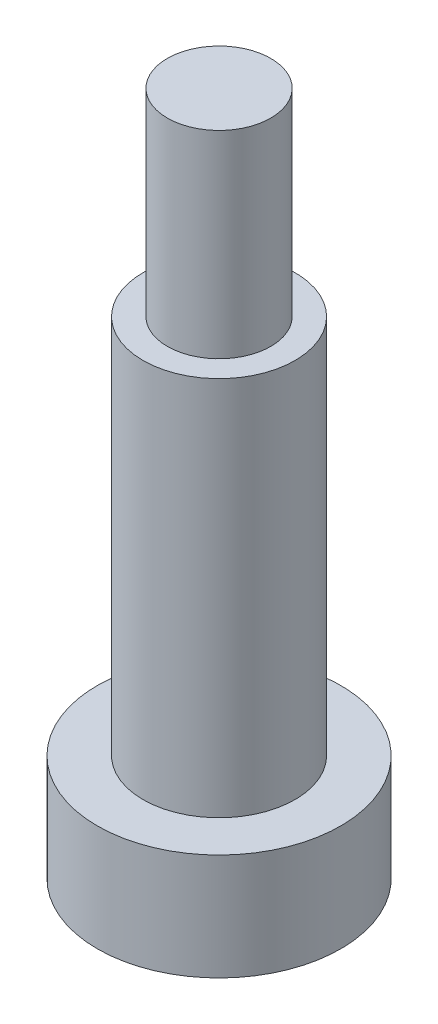
ISO-10303-21;
HEADER;
FILE_DESCRIPTION(('STEP AP214'),'2;1');
FILE_NAME('part.step','',(''),(''),'','','');
FILE_SCHEMA(('AUTOMOTIVE_DESIGN { 1 0 10303 214 1 1 1 1 }'));
ENDSEC;
DATA;
#1=APPLICATION_CONTEXT('core data for automotive mechanical design processes');
#2=APPLICATION_PROTOCOL_DEFINITION('international standard','automotive_design',2000,#1);
#3=PRODUCT_CONTEXT('',#1,'mechanical');
#4=PRODUCT('Part','Part','',(#3));
#5=PRODUCT_RELATED_PRODUCT_CATEGORY('part','',(#4));
#6=PRODUCT_DEFINITION_FORMATION('','',#4);
#7=PRODUCT_DEFINITION_CONTEXT('part definition',#1,'design');
#8=PRODUCT_DEFINITION('design','',#6,#7);
#9=PRODUCT_DEFINITION_SHAPE('','',#8);
#10=(LENGTH_UNIT() NAMED_UNIT(*) SI_UNIT(.MILLI.,.METRE.));
#11=(NAMED_UNIT(*) PLANE_ANGLE_UNIT() SI_UNIT($,.RADIAN.));
#12=(NAMED_UNIT(*) SI_UNIT($,.STERADIAN.) SOLID_ANGLE_UNIT());
#13=UNCERTAINTY_MEASURE_WITH_UNIT(LENGTH_MEASURE(1.E-05),#10,'distance_accuracy_value','');
#14=(GEOMETRIC_REPRESENTATION_CONTEXT(3) GLOBAL_UNCERTAINTY_ASSIGNED_CONTEXT((#13)) GLOBAL_UNIT_ASSIGNED_CONTEXT((#10,
#11,#12)) REPRESENTATION_CONTEXT('',''));
#15=CARTESIAN_POINT('',(0.,0.,0.));
#16=DIRECTION('',(0.,0.,1.));
#17=DIRECTION('',(1.,0.,0.));
#18=AXIS2_PLACEMENT_3D('',#15,#16,#17);
#19=CARTESIAN_POINT('',(152.4,9.825,171.45));
#20=DIRECTION('',(0.,-1.,0.));
#21=DIRECTION('',(0.,0.,-1.));
#22=AXIS2_PLACEMENT_3D('',#19,#20,#21);
#23=CYLINDRICAL_SURFACE('',#22,3.39999999999999);
#24=CARTESIAN_POINT('',(152.4,9.825,171.45));
#25=DIRECTION('',(0.,1.,0.));
#26=DIRECTION('',(0.,0.,1.));
#27=AXIS2_PLACEMENT_3D('',#24,#25,#26);
#28=CIRCLE('',#27,3.39999999999999);
#29=CARTESIAN_POINT('',(152.4,9.825,174.85));
#30=VERTEX_POINT('',#29);
#31=EDGE_CURVE('E10',#30,#30,#28,.T.);
#32=ORIENTED_EDGE('',*,*,#31,.F.);
#33=EDGE_LOOP('',(#32));
#34=FACE_BOUND('',#33,.T.);
#35=CARTESIAN_POINT('',(152.4,-3.175,171.45));
#36=DIRECTION('',(0.,1.,0.));
#37=DIRECTION('',(0.,0.,1.));
#38=AXIS2_PLACEMENT_3D('',#35,#36,#37);
#39=CIRCLE('',#38,3.39999999999999);
#40=CARTESIAN_POINT('',(152.4,-3.175,174.85));
#41=VERTEX_POINT('',#40);
#42=EDGE_CURVE('E46',#41,#41,#39,.T.);
#43=ORIENTED_EDGE('',*,*,#42,.T.);
#44=EDGE_LOOP('',(#43));
#45=FACE_BOUND('',#44,.T.);
#46=ADVANCED_FACE('F43',(#34,#45),#23,.T.);
#47=CARTESIAN_POINT('',(152.4,9.825,171.45));
#48=DIRECTION('',(0.,1.,0.));
#49=DIRECTION('',(0.,0.,1.));
#50=AXIS2_PLACEMENT_3D('',#47,#48,#49);
#51=PLANE('',#50);
#52=ORIENTED_EDGE('',*,*,#31,.T.);
#53=EDGE_LOOP('',(#52));
#54=FACE_BOUND('',#53,.T.);
#55=ADVANCED_FACE('F93',(#54),#51,.T.);
#56=CARTESIAN_POINT('',(152.4,-3.175,171.45));
#57=DIRECTION('',(0.,-1.,0.));
#58=DIRECTION('',(0.,0.,-1.));
#59=AXIS2_PLACEMENT_3D('',#56,#57,#58);
#60=CYLINDRICAL_SURFACE('',#59,5.);
#61=CARTESIAN_POINT('',(152.4,-3.175,171.45));
#62=DIRECTION('',(0.,1.,0.));
#63=DIRECTION('',(0.,0.,1.));
#64=AXIS2_PLACEMENT_3D('',#61,#62,#63);
#65=CIRCLE('',#64,5.);
#66=CARTESIAN_POINT('',(152.4,-3.175,176.45));
#67=VERTEX_POINT('',#66);
#68=EDGE_CURVE('E54',#67,#67,#65,.T.);
#69=ORIENTED_EDGE('',*,*,#68,.F.);
#70=EDGE_LOOP('',(#69));
#71=FACE_BOUND('',#70,.T.);
#72=CARTESIAN_POINT('',(152.4,-28.175,171.45));
#73=DIRECTION('',(0.,1.,0.));
#74=DIRECTION('',(0.,0.,1.));
#75=AXIS2_PLACEMENT_3D('',#72,#73,#74);
#76=CIRCLE('',#75,5.);
#77=CARTESIAN_POINT('',(152.4,-28.175,176.45));
#78=VERTEX_POINT('',#77);
#79=EDGE_CURVE('E60',#78,#78,#76,.T.);
#80=ORIENTED_EDGE('',*,*,#79,.T.);
#81=EDGE_LOOP('',(#80));
#82=FACE_BOUND('',#81,.T.);
#83=ADVANCED_FACE('F96',(#71,#82),#60,.T.);
#84=CARTESIAN_POINT('',(152.4,-3.175,171.45));
#85=DIRECTION('',(0.,1.,0.));
#86=DIRECTION('',(0.,0.,1.));
#87=AXIS2_PLACEMENT_3D('',#84,#85,#86);
#88=PLANE('',#87);
#89=ORIENTED_EDGE('',*,*,#42,.F.);
#90=EDGE_LOOP('',(#89));
#91=FACE_BOUND('',#90,.T.);
#92=ORIENTED_EDGE('',*,*,#68,.T.);
#93=EDGE_LOOP('',(#92));
#94=FACE_BOUND('',#93,.T.);
#95=ADVANCED_FACE('F105',(#91,#94),#88,.T.);
#96=CARTESIAN_POINT('',(152.4,-28.175,171.45));
#97=DIRECTION('',(0.,-1.,0.));
#98=DIRECTION('',(0.,0.,-1.));
#99=AXIS2_PLACEMENT_3D('',#96,#97,#98);
#100=CYLINDRICAL_SURFACE('',#99,8.00000000000001);
#101=CARTESIAN_POINT('',(152.4,-28.175,171.45));
#102=DIRECTION('',(0.,1.,0.));
#103=DIRECTION('',(0.,0.,1.));
#104=AXIS2_PLACEMENT_3D('',#101,#102,#103);
#105=CIRCLE('',#104,8.00000000000001);
#106=CARTESIAN_POINT('',(152.4,-28.175,179.45));
#107=VERTEX_POINT('',#106);
#108=EDGE_CURVE('E62',#107,#107,#105,.T.);
#109=ORIENTED_EDGE('',*,*,#108,.F.);
#110=EDGE_LOOP('',(#109));
#111=FACE_BOUND('',#110,.T.);
#112=CARTESIAN_POINT('',(152.4,-35.175,171.45));
#113=DIRECTION('',(0.,1.,0.));
#114=DIRECTION('',(0.,0.,1.));
#115=AXIS2_PLACEMENT_3D('',#112,#113,#114);
#116=CIRCLE('',#115,8.00000000000001);
#117=CARTESIAN_POINT('',(152.4,-35.175,179.45));
#118=VERTEX_POINT('',#117);
#119=EDGE_CURVE('E63',#118,#118,#116,.T.);
#120=ORIENTED_EDGE('',*,*,#119,.T.);
#121=EDGE_LOOP('',(#120));
#122=FACE_BOUND('',#121,.T.);
#123=ADVANCED_FACE('F102',(#111,#122),#100,.T.);
#124=CARTESIAN_POINT('',(152.4,-28.175,171.45));
#125=DIRECTION('',(0.,1.,0.));
#126=DIRECTION('',(0.,0.,1.));
#127=AXIS2_PLACEMENT_3D('',#124,#125,#126);
#128=PLANE('',#127);
#129=ORIENTED_EDGE('',*,*,#79,.F.);
#130=EDGE_LOOP('',(#129));
#131=FACE_BOUND('',#130,.T.);
#132=ORIENTED_EDGE('',*,*,#108,.T.);
#133=EDGE_LOOP('',(#132));
#134=FACE_BOUND('',#133,.T.);
#135=ADVANCED_FACE('F112',(#131,#134),#128,.T.);
#136=CARTESIAN_POINT('',(152.4,-35.175,171.45));
#137=DIRECTION('',(0.,1.,0.));
#138=DIRECTION('',(0.,0.,1.));
#139=AXIS2_PLACEMENT_3D('',#136,#137,#138);
#140=PLANE('',#139);
#141=CARTESIAN_POINT('',(152.4,-35.175,171.45));
#142=DIRECTION('',(0.,1.,0.));
#143=DIRECTION('',(0.,0.,1.));
#144=AXIS2_PLACEMENT_3D('',#141,#142,#143);
#145=CIRCLE('',#144,3.52);
#146=CARTESIAN_POINT('',(152.4,-35.175,174.97));
#147=VERTEX_POINT('',#146);
#148=EDGE_CURVE('E73',#147,#147,#145,.T.);
#149=ORIENTED_EDGE('',*,*,#148,.T.);
#150=EDGE_LOOP('',(#149));
#151=FACE_BOUND('',#150,.T.);
#152=ORIENTED_EDGE('',*,*,#119,.F.);
#153=EDGE_LOOP('',(#152));
#154=FACE_BOUND('',#153,.T.);
#155=ADVANCED_FACE('F89',(#151,#154),#140,.F.);
#156=CARTESIAN_POINT('',(152.4,-30.975,171.45));
#157=DIRECTION('',(0.,-1.,0.));
#158=DIRECTION('',(0.,0.,-1.));
#159=AXIS2_PLACEMENT_3D('',#156,#157,#158);
#160=CYLINDRICAL_SURFACE('',#159,3.52);
#161=CARTESIAN_POINT('',(152.4,-30.975,171.45));
#162=DIRECTION('',(0.,1.,0.));
#163=DIRECTION('',(0.,0.,1.));
#164=AXIS2_PLACEMENT_3D('',#161,#162,#163);
#165=CIRCLE('',#164,3.52);
#166=CARTESIAN_POINT('',(152.4,-30.975,174.97));
#167=VERTEX_POINT('',#166);
#168=EDGE_CURVE('E67',#167,#167,#165,.T.);
#169=ORIENTED_EDGE('',*,*,#168,.T.);
#170=EDGE_LOOP('',(#169));
#171=FACE_BOUND('',#170,.T.);
#172=ORIENTED_EDGE('',*,*,#148,.F.);
#173=EDGE_LOOP('',(#172));
#174=FACE_BOUND('',#173,.T.);
#175=ADVANCED_FACE('F82',(#171,#174),#160,.F.);
#176=CARTESIAN_POINT('',(152.4,-30.975,171.45));
#177=DIRECTION('',(0.,1.,0.));
#178=DIRECTION('',(0.,0.,1.));
#179=AXIS2_PLACEMENT_3D('',#176,#177,#178);
#180=PLANE('',#179);
#181=ORIENTED_EDGE('',*,*,#168,.F.);
#182=EDGE_LOOP('',(#181));
#183=FACE_BOUND('',#182,.T.);
#184=ADVANCED_FACE('F81',(#183),#180,.F.);
#185=CLOSED_SHELL('',(#46,#55,#83,#95,#123,#135,#155,#175,#184));
#186=MANIFOLD_SOLID_BREP('B2',#185);
#187=ADVANCED_BREP_SHAPE_REPRESENTATION('',(#18,#186),#14);
#188=SHAPE_DEFINITION_REPRESENTATION(#9,#187);
ENDSEC;
END-ISO-10303-21;
